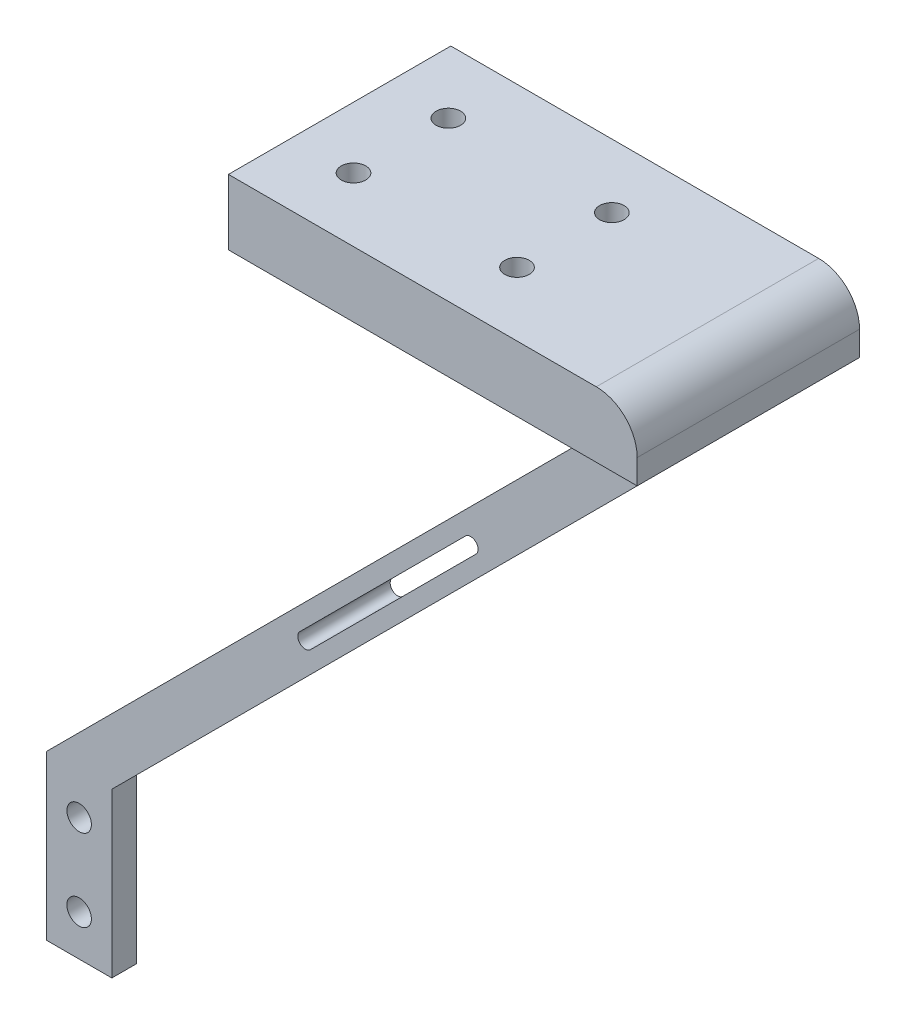
ISO-10303-21;
HEADER;
FILE_DESCRIPTION(('STEP AP214'),'2;1');
FILE_NAME('part.step','',(''),(''),'','','');
FILE_SCHEMA(('AUTOMOTIVE_DESIGN { 1 0 10303 214 1 1 1 1 }'));
ENDSEC;
DATA;
#1=APPLICATION_CONTEXT('core data for automotive mechanical design processes');
#2=APPLICATION_PROTOCOL_DEFINITION('international standard','automotive_design',2000,#1);
#3=PRODUCT_CONTEXT('',#1,'mechanical');
#4=PRODUCT('Part','Part','',(#3));
#5=PRODUCT_RELATED_PRODUCT_CATEGORY('part','',(#4));
#6=PRODUCT_DEFINITION_FORMATION('','',#4);
#7=PRODUCT_DEFINITION_CONTEXT('part definition',#1,'design');
#8=PRODUCT_DEFINITION('design','',#6,#7);
#9=PRODUCT_DEFINITION_SHAPE('','',#8);
#10=(LENGTH_UNIT() NAMED_UNIT(*) SI_UNIT(.MILLI.,.METRE.));
#11=(NAMED_UNIT(*) PLANE_ANGLE_UNIT() SI_UNIT($,.RADIAN.));
#12=(NAMED_UNIT(*) SI_UNIT($,.STERADIAN.) SOLID_ANGLE_UNIT());
#13=UNCERTAINTY_MEASURE_WITH_UNIT(LENGTH_MEASURE(1.E-05),#10,'distance_accuracy_value','');
#14=(GEOMETRIC_REPRESENTATION_CONTEXT(3) GLOBAL_UNCERTAINTY_ASSIGNED_CONTEXT((#13)) GLOBAL_UNIT_ASSIGNED_CONTEXT((#10,
#11,#12)) REPRESENTATION_CONTEXT('',''));
#15=CARTESIAN_POINT('',(0.,0.,0.));
#16=DIRECTION('',(0.,0.,1.));
#17=DIRECTION('',(1.,0.,0.));
#18=AXIS2_PLACEMENT_3D('',#15,#16,#17);
#19=CARTESIAN_POINT('',(0.,-901.769321881352,7.4499999999999));
#20=DIRECTION('',(0.,-1.,0.));
#21=DIRECTION('',(0.,0.,-1.));
#22=AXIS2_PLACEMENT_3D('',#19,#20,#21);
#23=PLANE('',#22);
#24=CARTESIAN_POINT('',(33.720070615742,-901.769321881352,1.64999999999989));
#25=DIRECTION('',(0.,-1.,0.));
#26=DIRECTION('',(0.,0.,-1.));
#27=AXIS2_PLACEMENT_3D('',#24,#25,#26);
#28=CIRCLE('',#27,1.5);
#29=CARTESIAN_POINT('',(33.720070615742,-901.769321881352,0.149999999999891));
#30=VERTEX_POINT('',#29);
#31=EDGE_CURVE('E228',#30,#30,#28,.T.);
#32=ORIENTED_EDGE('',*,*,#31,.F.);
#33=EDGE_LOOP('',(#32));
#34=FACE_BOUND('',#33,.T.);
#35=CARTESIAN_POINT('',(13.720070615742,-901.769321881352,1.64999999999989));
#36=DIRECTION('',(0.,-1.,0.));
#37=DIRECTION('',(0.,0.,-1.));
#38=AXIS2_PLACEMENT_3D('',#35,#36,#37);
#39=CIRCLE('',#38,1.5);
#40=CARTESIAN_POINT('',(13.720070615742,-901.769321881352,0.14999999999989));
#41=VERTEX_POINT('',#40);
#42=EDGE_CURVE('E240',#41,#41,#39,.T.);
#43=ORIENTED_EDGE('',*,*,#42,.F.);
#44=EDGE_LOOP('',(#43));
#45=FACE_BOUND('',#44,.T.);
#46=DIRECTION('',(0.,0.,-1.));
#47=VECTOR('',#46,1.);
#48=CARTESIAN_POINT('',(42.2200706157402,-901.769321881352,11.4852813742387));
#49=LINE('',#48,#47);
#50=CARTESIAN_POINT('',(42.2200706157402,-901.769321881352,3.));
#51=VERTEX_POINT('',#50);
#52=CARTESIAN_POINT('',(42.2200706157402,-901.769321881352,-8.3000000000001));
#53=VERTEX_POINT('',#52);
#54=EDGE_CURVE('E296',#51,#53,#49,.T.);
#55=ORIENTED_EDGE('',*,*,#54,.F.);
#56=DIRECTION('',(1.,0.,0.));
#57=VECTOR('',#56,1.);
#58=CARTESIAN_POINT('',(1.21129623552184E-11,-901.769321881353,3.));
#59=LINE('',#58,#57);
#60=CARTESIAN_POINT('',(56.2200706157419,-901.769321881352,3.));
#61=VERTEX_POINT('',#60);
#62=EDGE_CURVE('E368',#51,#61,#59,.T.);
#63=ORIENTED_EDGE('',*,*,#62,.T.);
#64=DIRECTION('',(0.,0.,-1.));
#65=VECTOR('',#64,1.);
#66=CARTESIAN_POINT('',(56.2200706157419,-901.769321881352,7.4499999999999));
#67=LINE('',#66,#65);
#68=CARTESIAN_POINT('',(56.220070615742,-901.769321881352,9.4499999999999));
#69=VERTEX_POINT('',#68);
#70=EDGE_CURVE('E332',#69,#61,#67,.T.);
#71=ORIENTED_EDGE('',*,*,#70,.F.);
#72=DIRECTION('',(1.,0.,0.));
#73=VECTOR('',#72,1.);
#74=CARTESIAN_POINT('',(2.25190750407005E-12,-901.769321881352,9.4499999999999));
#75=LINE('',#74,#73);
#76=CARTESIAN_POINT('',(6.22007061574198,-901.769321881352,9.4499999999999));
#77=VERTEX_POINT('',#76);
#78=EDGE_CURVE('E277',#77,#69,#75,.T.);
#79=ORIENTED_EDGE('',*,*,#78,.F.);
#80=DIRECTION('',(0.,0.,-1.));
#81=VECTOR('',#80,1.);
#82=CARTESIAN_POINT('',(6.22007061574196,-901.769321881352,7.4499999999999));
#83=LINE('',#82,#81);
#84=CARTESIAN_POINT('',(6.22007061574198,-901.769321881352,-17.7500000000001));
#85=VERTEX_POINT('',#84);
#86=EDGE_CURVE('E309',#77,#85,#83,.T.);
#87=ORIENTED_EDGE('',*,*,#86,.T.);
#88=DIRECTION('',(1.,0.,0.));
#89=VECTOR('',#88,1.);
#90=CARTESIAN_POINT('',(2.25190750407005E-12,-901.769321881352,-17.7500000000001));
#91=LINE('',#90,#89);
#92=CARTESIAN_POINT('',(56.220070615742,-901.769321881352,-17.7500000000001));
#93=VERTEX_POINT('',#92);
#94=EDGE_CURVE('E260',#85,#93,#91,.T.);
#95=ORIENTED_EDGE('',*,*,#94,.T.);
#96=CARTESIAN_POINT('',(56.2200706157419,-901.769321881352,-8.3000000000001));
#97=VERTEX_POINT('',#96);
#98=EDGE_CURVE('E331',#97,#93,#67,.T.);
#99=ORIENTED_EDGE('',*,*,#98,.F.);
#100=DIRECTION('',(1.,0.,0.));
#101=VECTOR('',#100,1.);
#102=CARTESIAN_POINT('',(1.21129623552184E-11,-901.769321881353,-8.3000000000001));
#103=LINE('',#102,#101);
#104=EDGE_CURVE('E336',#53,#97,#103,.T.);
#105=ORIENTED_EDGE('',*,*,#104,.F.);
#106=EDGE_LOOP('',(#55,#63,#71,#79,#87,#95,#99,#105));
#107=FACE_BOUND('',#106,.T.);
#108=CARTESIAN_POINT('',(33.720070615742,-901.769321881352,-9.95000000000009));
#109=DIRECTION('',(0.,-1.,0.));
#110=DIRECTION('',(0.,0.,-1.));
#111=AXIS2_PLACEMENT_3D('',#108,#109,#110);
#112=CIRCLE('',#111,1.5);
#113=CARTESIAN_POINT('',(33.720070615742,-901.769321881352,-11.4500000000001));
#114=VERTEX_POINT('',#113);
#115=EDGE_CURVE('E220',#114,#114,#112,.F.);
#116=ORIENTED_EDGE('',*,*,#115,.T.);
#117=EDGE_LOOP('',(#116));
#118=FACE_BOUND('',#117,.T.);
#119=CARTESIAN_POINT('',(13.720070615742,-901.769321881352,-9.95000000000009));
#120=DIRECTION('',(0.,-1.,0.));
#121=DIRECTION('',(0.,0.,-1.));
#122=AXIS2_PLACEMENT_3D('',#119,#120,#121);
#123=CIRCLE('',#122,1.5);
#124=CARTESIAN_POINT('',(13.720070615742,-901.769321881352,-11.4500000000001));
#125=VERTEX_POINT('',#124);
#126=EDGE_CURVE('E219',#125,#125,#123,.F.);
#127=ORIENTED_EDGE('',*,*,#126,.T.);
#128=EDGE_LOOP('',(#127));
#129=FACE_BOUND('',#128,.T.);
#130=ADVANCED_FACE('F41',(#34,#45,#107,#118,#129),#23,.T.);
#131=CARTESIAN_POINT('',(1.98456655971258E-12,-893.769321881352,7.4499999999999));
#132=DIRECTION('',(0.,1.,0.));
#133=DIRECTION('',(-1.,0.,0.));
#134=AXIS2_PLACEMENT_3D('',#131,#132,#133);
#135=PLANE('',#134);
#136=CARTESIAN_POINT('',(33.720070615742,-893.769321881352,1.64999999999989));
#137=DIRECTION('',(0.,1.,0.));
#138=DIRECTION('',(-1.,0.,0.));
#139=AXIS2_PLACEMENT_3D('',#136,#137,#138);
#140=CIRCLE('',#139,1.5);
#141=CARTESIAN_POINT('',(32.220070615742,-893.769321881352,1.64999999999989));
#142=VERTEX_POINT('',#141);
#143=EDGE_CURVE('E224',#142,#142,#140,.F.);
#144=ORIENTED_EDGE('',*,*,#143,.T.);
#145=EDGE_LOOP('',(#144));
#146=FACE_BOUND('',#145,.T.);
#147=CARTESIAN_POINT('',(13.720070615742,-893.769321881352,1.64999999999989));
#148=DIRECTION('',(0.,1.,0.));
#149=DIRECTION('',(-1.,0.,0.));
#150=AXIS2_PLACEMENT_3D('',#147,#148,#149);
#151=CIRCLE('',#150,1.5);
#152=CARTESIAN_POINT('',(12.220070615742,-893.769321881352,1.64999999999989));
#153=VERTEX_POINT('',#152);
#154=EDGE_CURVE('E227',#153,#153,#151,.F.);
#155=ORIENTED_EDGE('',*,*,#154,.T.);
#156=EDGE_LOOP('',(#155));
#157=FACE_BOUND('',#156,.T.);
#158=DIRECTION('',(1.,0.,0.));
#159=VECTOR('',#158,1.);
#160=CARTESIAN_POINT('',(2.23414393567604E-12,-893.769321881352,9.4499999999999));
#161=LINE('',#160,#159);
#162=CARTESIAN_POINT('',(6.22007061574196,-893.769321881352,9.4499999999999));
#163=VERTEX_POINT('',#162);
#164=CARTESIAN_POINT('',(51.220070615742,-893.769321881352,9.4499999999999));
#165=VERTEX_POINT('',#164);
#166=EDGE_CURVE('E259',#163,#165,#161,.T.);
#167=ORIENTED_EDGE('',*,*,#166,.T.);
#168=DIRECTION('',(0.,0.,-1.));
#169=VECTOR('',#168,1.);
#170=CARTESIAN_POINT('',(51.220070615742,-893.769321881352,7.4499999999999));
#171=LINE('',#170,#169);
#172=CARTESIAN_POINT('',(51.220070615742,-893.769321881352,-17.7500000000001));
#173=VERTEX_POINT('',#172);
#174=EDGE_CURVE('E404',#165,#173,#171,.T.);
#175=ORIENTED_EDGE('',*,*,#174,.T.);
#176=DIRECTION('',(1.,0.,0.));
#177=VECTOR('',#176,1.);
#178=CARTESIAN_POINT('',(2.23414393567604E-12,-893.769321881352,-17.7500000000001));
#179=LINE('',#178,#177);
#180=CARTESIAN_POINT('',(6.22007061574196,-893.769321881352,-17.7500000000001));
#181=VERTEX_POINT('',#180);
#182=EDGE_CURVE('E264',#181,#173,#179,.T.);
#183=ORIENTED_EDGE('',*,*,#182,.F.);
#184=DIRECTION('',(0.,0.,-1.));
#185=VECTOR('',#184,1.);
#186=CARTESIAN_POINT('',(6.22007061574196,-893.769321881352,7.4499999999999));
#187=LINE('',#186,#185);
#188=EDGE_CURVE('E329',#163,#181,#187,.T.);
#189=ORIENTED_EDGE('',*,*,#188,.F.);
#190=EDGE_LOOP('',(#167,#175,#183,#189));
#191=FACE_BOUND('',#190,.T.);
#192=CARTESIAN_POINT('',(33.720070615742,-893.769321881352,-9.95000000000009));
#193=DIRECTION('',(0.,1.,0.));
#194=DIRECTION('',(-1.,0.,0.));
#195=AXIS2_PLACEMENT_3D('',#192,#193,#194);
#196=CIRCLE('',#195,1.5);
#197=CARTESIAN_POINT('',(32.220070615742,-893.769321881352,-9.95000000000009));
#198=VERTEX_POINT('',#197);
#199=EDGE_CURVE('E223',#198,#198,#196,.T.);
#200=ORIENTED_EDGE('',*,*,#199,.F.);
#201=EDGE_LOOP('',(#200));
#202=FACE_BOUND('',#201,.T.);
#203=CARTESIAN_POINT('',(13.720070615742,-893.769321881352,-9.95000000000009));
#204=DIRECTION('',(0.,1.,0.));
#205=DIRECTION('',(-1.,0.,0.));
#206=AXIS2_PLACEMENT_3D('',#203,#204,#205);
#207=CIRCLE('',#206,1.5);
#208=CARTESIAN_POINT('',(12.220070615742,-893.769321881352,-9.95000000000009));
#209=VERTEX_POINT('',#208);
#210=EDGE_CURVE('E231',#209,#209,#207,.T.);
#211=ORIENTED_EDGE('',*,*,#210,.F.);
#212=EDGE_LOOP('',(#211));
#213=FACE_BOUND('',#212,.T.);
#214=ADVANCED_FACE('F431',(#146,#157,#191,#202,#213),#135,.T.);
#215=CARTESIAN_POINT('',(0.,-896.019321881352,7.4499999999999));
#216=DIRECTION('',(0.,1.,0.));
#217=DIRECTION('',(0.,0.,1.));
#218=AXIS2_PLACEMENT_3D('',#215,#216,#217);
#219=PLANE('',#218);
#220=CARTESIAN_POINT('',(33.720070615742,-896.019321881352,-9.95000000000009));
#221=DIRECTION('',(0.,1.,0.));
#222=DIRECTION('',(0.,0.,1.));
#223=AXIS2_PLACEMENT_3D('',#220,#221,#222);
#224=CIRCLE('',#223,1.5);
#225=CARTESIAN_POINT('',(33.720070615742,-896.019321881352,-8.45000000000009));
#226=VERTEX_POINT('',#225);
#227=EDGE_CURVE('E248',#226,#226,#224,.T.);
#228=ORIENTED_EDGE('',*,*,#227,.T.);
#229=EDGE_LOOP('',(#228));
#230=FACE_BOUND('',#229,.T.);
#231=CARTESIAN_POINT('',(13.720070615742,-896.019321881352,1.64999999999989));
#232=DIRECTION('',(0.,1.,0.));
#233=DIRECTION('',(0.,0.,1.));
#234=AXIS2_PLACEMENT_3D('',#231,#232,#233);
#235=CIRCLE('',#234,1.5);
#236=CARTESIAN_POINT('',(13.720070615742,-896.019321881352,3.1499999999999));
#237=VERTEX_POINT('',#236);
#238=EDGE_CURVE('E244',#237,#237,#235,.F.);
#239=ORIENTED_EDGE('',*,*,#238,.F.);
#240=EDGE_LOOP('',(#239));
#241=FACE_BOUND('',#240,.T.);
#242=DIRECTION('',(1.,0.,0.));
#243=VECTOR('',#242,1.);
#244=CARTESIAN_POINT('',(0.,-896.019321881352,-15.7500000000001));
#245=LINE('',#244,#243);
#246=CARTESIAN_POINT('',(6.22007061574197,-896.019321881352,-15.7500000000001));
#247=VERTEX_POINT('',#246);
#248=CARTESIAN_POINT('',(40.220070615742,-896.019321881352,-15.7500000000001));
#249=VERTEX_POINT('',#248);
#250=EDGE_CURVE('E295',#247,#249,#245,.T.);
#251=ORIENTED_EDGE('',*,*,#250,.T.);
#252=DIRECTION('',(0.,0.,-1.));
#253=VECTOR('',#252,1.);
#254=CARTESIAN_POINT('',(40.220070615742,-896.019321881352,7.4499999999999));
#255=LINE('',#254,#253);
#256=CARTESIAN_POINT('',(40.220070615742,-896.019321881352,7.4499999999999));
#257=VERTEX_POINT('',#256);
#258=EDGE_CURVE('E323',#257,#249,#255,.T.);
#259=ORIENTED_EDGE('',*,*,#258,.F.);
#260=DIRECTION('',(1.,0.,0.));
#261=VECTOR('',#260,1.);
#262=CARTESIAN_POINT('',(0.,-896.019321881352,7.4499999999999));
#263=LINE('',#262,#261);
#264=CARTESIAN_POINT('',(6.22007061574197,-896.019321881352,7.4499999999999));
#265=VERTEX_POINT('',#264);
#266=EDGE_CURVE('E301',#265,#257,#263,.T.);
#267=ORIENTED_EDGE('',*,*,#266,.F.);
#268=DIRECTION('',(0.,0.,-1.));
#269=VECTOR('',#268,1.);
#270=CARTESIAN_POINT('',(6.22007061574196,-896.019321881352,7.4499999999999));
#271=LINE('',#270,#269);
#272=EDGE_CURVE('E326',#265,#247,#271,.T.);
#273=ORIENTED_EDGE('',*,*,#272,.T.);
#274=EDGE_LOOP('',(#251,#259,#267,#273));
#275=FACE_BOUND('',#274,.T.);
#276=CARTESIAN_POINT('',(33.720070615742,-896.019321881352,1.64999999999989));
#277=DIRECTION('',(0.,1.,0.));
#278=DIRECTION('',(0.,0.,1.));
#279=AXIS2_PLACEMENT_3D('',#276,#277,#278);
#280=CIRCLE('',#279,1.5);
#281=CARTESIAN_POINT('',(33.720070615742,-896.019321881352,3.1499999999999));
#282=VERTEX_POINT('',#281);
#283=EDGE_CURVE('E252',#282,#282,#280,.F.);
#284=ORIENTED_EDGE('',*,*,#283,.F.);
#285=EDGE_LOOP('',(#284));
#286=FACE_BOUND('',#285,.T.);
#287=CARTESIAN_POINT('',(13.720070615742,-896.019321881352,-9.95000000000009));
#288=DIRECTION('',(0.,1.,0.));
#289=DIRECTION('',(0.,0.,1.));
#290=AXIS2_PLACEMENT_3D('',#287,#288,#289);
#291=CIRCLE('',#290,1.5);
#292=CARTESIAN_POINT('',(13.720070615742,-896.019321881352,-8.45000000000009));
#293=VERTEX_POINT('',#292);
#294=EDGE_CURVE('E256',#293,#293,#291,.T.);
#295=ORIENTED_EDGE('',*,*,#294,.T.);
#296=EDGE_LOOP('',(#295));
#297=FACE_BOUND('',#296,.T.);
#298=ADVANCED_FACE('F498',(#230,#241,#275,#286,#297),#219,.F.);
#299=CARTESIAN_POINT('',(0.,-899.519321881352,7.4499999999999));
#300=DIRECTION('',(0.,1.,0.));
#301=DIRECTION('',(0.,0.,1.));
#302=AXIS2_PLACEMENT_3D('',#299,#300,#301);
#303=PLANE('',#302);
#304=CARTESIAN_POINT('',(33.720070615742,-899.519321881352,1.64999999999989));
#305=DIRECTION('',(0.,1.,0.));
#306=DIRECTION('',(0.,0.,1.));
#307=AXIS2_PLACEMENT_3D('',#304,#305,#306);
#308=CIRCLE('',#307,1.5);
#309=CARTESIAN_POINT('',(33.720070615742,-899.519321881352,3.1499999999999));
#310=VERTEX_POINT('',#309);
#311=EDGE_CURVE('E251',#310,#310,#308,.F.);
#312=ORIENTED_EDGE('',*,*,#311,.T.);
#313=EDGE_LOOP('',(#312));
#314=FACE_BOUND('',#313,.T.);
#315=CARTESIAN_POINT('',(13.720070615742,-899.519321881352,1.64999999999989));
#316=DIRECTION('',(0.,1.,0.));
#317=DIRECTION('',(0.,0.,1.));
#318=AXIS2_PLACEMENT_3D('',#315,#316,#317);
#319=CIRCLE('',#318,1.5);
#320=CARTESIAN_POINT('',(13.720070615742,-899.519321881352,3.1499999999999));
#321=VERTEX_POINT('',#320);
#322=EDGE_CURVE('E243',#321,#321,#319,.F.);
#323=ORIENTED_EDGE('',*,*,#322,.T.);
#324=EDGE_LOOP('',(#323));
#325=FACE_BOUND('',#324,.T.);
#326=DIRECTION('',(1.,0.,0.));
#327=VECTOR('',#326,1.);
#328=CARTESIAN_POINT('',(0.,-899.519321881352,-15.7500000000001));
#329=LINE('',#328,#327);
#330=CARTESIAN_POINT('',(6.22007061574197,-899.519321881352,-15.7500000000001));
#331=VERTEX_POINT('',#330);
#332=CARTESIAN_POINT('',(40.220070615742,-899.519321881352,-15.7500000000001));
#333=VERTEX_POINT('',#332);
#334=EDGE_CURVE('E304',#331,#333,#329,.T.);
#335=ORIENTED_EDGE('',*,*,#334,.F.);
#336=DIRECTION('',(0.,0.,-1.));
#337=VECTOR('',#336,1.);
#338=CARTESIAN_POINT('',(6.22007061574196,-899.519321881352,7.4499999999999));
#339=LINE('',#338,#337);
#340=CARTESIAN_POINT('',(6.22007061574197,-899.519321881352,7.4499999999999));
#341=VERTEX_POINT('',#340);
#342=EDGE_CURVE('E317',#341,#331,#339,.T.);
#343=ORIENTED_EDGE('',*,*,#342,.F.);
#344=DIRECTION('',(1.,0.,0.));
#345=VECTOR('',#344,1.);
#346=CARTESIAN_POINT('',(0.,-899.519321881352,7.4499999999999));
#347=LINE('',#346,#345);
#348=CARTESIAN_POINT('',(40.220070615742,-899.519321881352,7.4499999999999));
#349=VERTEX_POINT('',#348);
#350=EDGE_CURVE('E306',#341,#349,#347,.T.);
#351=ORIENTED_EDGE('',*,*,#350,.T.);
#352=DIRECTION('',(0.,0.,-1.));
#353=VECTOR('',#352,1.);
#354=CARTESIAN_POINT('',(40.220070615742,-899.519321881352,7.4499999999999));
#355=LINE('',#354,#353);
#356=EDGE_CURVE('E320',#349,#333,#355,.T.);
#357=ORIENTED_EDGE('',*,*,#356,.T.);
#358=EDGE_LOOP('',(#335,#343,#351,#357));
#359=FACE_BOUND('',#358,.T.);
#360=CARTESIAN_POINT('',(33.720070615742,-899.519321881352,-9.95000000000009));
#361=DIRECTION('',(0.,1.,0.));
#362=DIRECTION('',(0.,0.,1.));
#363=AXIS2_PLACEMENT_3D('',#360,#361,#362);
#364=CIRCLE('',#363,1.5);
#365=CARTESIAN_POINT('',(33.720070615742,-899.519321881352,-8.45000000000009));
#366=VERTEX_POINT('',#365);
#367=EDGE_CURVE('E247',#366,#366,#364,.T.);
#368=ORIENTED_EDGE('',*,*,#367,.F.);
#369=EDGE_LOOP('',(#368));
#370=FACE_BOUND('',#369,.T.);
#371=CARTESIAN_POINT('',(13.720070615742,-899.519321881352,-9.95000000000009));
#372=DIRECTION('',(0.,1.,0.));
#373=DIRECTION('',(0.,0.,1.));
#374=AXIS2_PLACEMENT_3D('',#371,#372,#373);
#375=CIRCLE('',#374,1.5);
#376=CARTESIAN_POINT('',(13.720070615742,-899.519321881352,-8.45000000000009));
#377=VERTEX_POINT('',#376);
#378=EDGE_CURVE('E255',#377,#377,#375,.T.);
#379=ORIENTED_EDGE('',*,*,#378,.F.);
#380=EDGE_LOOP('',(#379));
#381=FACE_BOUND('',#380,.T.);
#382=ADVANCED_FACE('F485',(#314,#325,#359,#370,#381),#303,.T.);
#383=CARTESIAN_POINT('',(474.994696248546,-474.994696248551,3.));
#384=DIRECTION('',(-0.707106781186544,0.707106781186551,0.));
#385=DIRECTION('',(-0.707106781186551,-0.707106781186544,0.));
#386=AXIS2_PLACEMENT_3D('',#383,#384,#385);
#387=PLANE('',#386);
#388=DIRECTION('',(0.707106781186551,0.707106781186544,0.));
#389=VECTOR('',#388,1.);
#390=CARTESIAN_POINT('',(474.994696248546,-474.994696248551,3.));
#391=LINE('',#390,#389);
#392=CARTESIAN_POINT('',(-22.4906075029149,-972.480000000007,3.));
#393=VERTEX_POINT('',#392);
#394=CARTESIAN_POINT('',(42.2200706157402,-907.769321881352,3.));
#395=VERTEX_POINT('',#394);
#396=EDGE_CURVE('E371',#393,#395,#391,.T.);
#397=ORIENTED_EDGE('',*,*,#396,.T.);
#398=DIRECTION('',(0.,0.,-1.));
#399=VECTOR('',#398,1.);
#400=CARTESIAN_POINT('',(42.2200706157402,-907.769321881352,11.4852813742387));
#401=LINE('',#400,#399);
#402=CARTESIAN_POINT('',(42.2200706157402,-907.769321881352,-8.3000000000001));
#403=VERTEX_POINT('',#402);
#404=EDGE_CURVE('E291',#395,#403,#401,.T.);
#405=ORIENTED_EDGE('',*,*,#404,.T.);
#406=DIRECTION('',(0.707106781186551,0.707106781186544,0.));
#407=VECTOR('',#406,1.);
#408=CARTESIAN_POINT('',(474.994696248546,-474.994696248551,-8.3000000000001));
#409=LINE('',#408,#407);
#410=CARTESIAN_POINT('',(-22.4906075029149,-972.480000000007,-8.3000000000001));
#411=VERTEX_POINT('',#410);
#412=EDGE_CURVE('E338',#411,#403,#409,.T.);
#413=ORIENTED_EDGE('',*,*,#412,.F.);
#414=DIRECTION('',(0.,0.,1.));
#415=VECTOR('',#414,1.);
#416=CARTESIAN_POINT('',(-22.4906075029149,-972.480000000007,-8.3000000000001));
#417=LINE('',#416,#415);
#418=CARTESIAN_POINT('',(-22.4906075029149,-972.480000000007,0.));
#419=VERTEX_POINT('',#418);
#420=EDGE_CURVE('E346',#411,#419,#417,.T.);
#421=ORIENTED_EDGE('',*,*,#420,.T.);
#422=DIRECTION('',(0.,0.,-1.));
#423=VECTOR('',#422,1.);
#424=CARTESIAN_POINT('',(-22.4906075029149,-972.480000000007,3.));
#425=LINE('',#424,#423);
#426=EDGE_CURVE('E395',#393,#419,#425,.T.);
#427=ORIENTED_EDGE('',*,*,#426,.F.);
#428=EDGE_LOOP('',(#397,#405,#413,#421,#427));
#429=FACE_BOUND('',#428,.T.);
#430=ADVANCED_FACE('F466',(#429),#387,.T.);
#431=CARTESIAN_POINT('',(0.,0.,0.));
#432=DIRECTION('',(0.,0.,1.));
#433=DIRECTION('',(1.,0.,0.));
#434=AXIS2_PLACEMENT_3D('',#431,#432,#433);
#435=PLANE('',#434);
#436=CARTESIAN_POINT('',(-18.4906075028776,-977.480000000007,0.));
#437=DIRECTION('',(0.,0.,1.));
#438=DIRECTION('',(1.,0.,0.));
#439=AXIS2_PLACEMENT_3D('',#436,#437,#438);
#440=CIRCLE('',#439,1.50000000001363);
#441=CARTESIAN_POINT('',(-16.9906075028639,-977.480000000007,0.));
#442=VERTEX_POINT('',#441);
#443=EDGE_CURVE('E381',#442,#442,#440,.T.);
#444=ORIENTED_EDGE('',*,*,#443,.T.);
#445=EDGE_LOOP('',(#444));
#446=FACE_BOUND('',#445,.T.);
#447=CARTESIAN_POINT('',(-18.4906075028776,-987.480000000007,0.));
#448=DIRECTION('',(0.,0.,1.));
#449=DIRECTION('',(1.,0.,0.));
#450=AXIS2_PLACEMENT_3D('',#447,#448,#449);
#451=CIRCLE('',#450,1.50000000001363);
#452=CARTESIAN_POINT('',(-16.9906075028639,-987.480000000007,0.));
#453=VERTEX_POINT('',#452);
#454=EDGE_CURVE('E352',#453,#453,#451,.T.);
#455=ORIENTED_EDGE('',*,*,#454,.T.);
#456=EDGE_LOOP('',(#455));
#457=FACE_BOUND('',#456,.T.);
#458=DIRECTION('',(-1.,0.,0.));
#459=VECTOR('',#458,1.);
#460=CARTESIAN_POINT('',(0.,-972.480000000007,0.));
#461=LINE('',#460,#459);
#462=CARTESIAN_POINT('',(-14.4906075029133,-972.480000000007,0.));
#463=VERTEX_POINT('',#462);
#464=EDGE_CURVE('E335',#463,#419,#461,.T.);
#465=ORIENTED_EDGE('',*,*,#464,.F.);
#466=DIRECTION('',(-1.7916632230118E-12,1.,0.));
#467=VECTOR('',#466,1.);
#468=CARTESIAN_POINT('',(-14.4906075046556,-2.59622885451903E-11,0.));
#469=LINE('',#468,#467);
#470=CARTESIAN_POINT('',(-14.4906075027914,-992.480000000007,0.));
#471=VERTEX_POINT('',#470);
#472=EDGE_CURVE('E384',#471,#463,#469,.T.);
#473=ORIENTED_EDGE('',*,*,#472,.F.);
#474=DIRECTION('',(1.,0.,0.));
#475=VECTOR('',#474,1.);
#476=CARTESIAN_POINT('',(0.,-992.480000000007,0.));
#477=LINE('',#476,#475);
#478=CARTESIAN_POINT('',(-22.4906075029149,-992.480000000007,0.));
#479=VERTEX_POINT('',#478);
#480=EDGE_CURVE('E359',#479,#471,#477,.T.);
#481=ORIENTED_EDGE('',*,*,#480,.F.);
#482=DIRECTION('',(0.,-1.,0.));
#483=VECTOR('',#482,1.);
#484=CARTESIAN_POINT('',(-22.4906075029149,0.,0.));
#485=LINE('',#484,#483);
#486=EDGE_CURVE('E387',#419,#479,#485,.T.);
#487=ORIENTED_EDGE('',*,*,#486,.F.);
#488=EDGE_LOOP('',(#465,#473,#481,#487));
#489=FACE_BOUND('',#488,.T.);
#490=ADVANCED_FACE('F475',(#446,#457,#489),#435,.F.);
#491=CARTESIAN_POINT('',(-14.4906075046556,-2.59622885451903E-11,3.));
#492=DIRECTION('',(-1.,-1.7916632230118E-12,0.));
#493=DIRECTION('',(1.7916632230118E-12,-1.,0.));
#494=AXIS2_PLACEMENT_3D('',#491,#492,#493);
#495=PLANE('',#494);
#496=ORIENTED_EDGE('',*,*,#472,.T.);
#497=DIRECTION('',(0.,0.,-1.));
#498=VECTOR('',#497,1.);
#499=CARTESIAN_POINT('',(-14.4906075029133,-972.480000000007,3.));
#500=LINE('',#499,#498);
#501=CARTESIAN_POINT('',(-14.4906075029133,-972.480000000007,3.));
#502=VERTEX_POINT('',#501);
#503=EDGE_CURVE('E401',#502,#463,#500,.T.);
#504=ORIENTED_EDGE('',*,*,#503,.F.);
#505=DIRECTION('',(-1.7916632230118E-12,1.,0.));
#506=VECTOR('',#505,1.);
#507=CARTESIAN_POINT('',(-14.4906075046556,-2.59622885451903E-11,3.));
#508=LINE('',#507,#506);
#509=CARTESIAN_POINT('',(-14.4906075027914,-992.480000000007,3.));
#510=VERTEX_POINT('',#509);
#511=EDGE_CURVE('E362',#510,#502,#508,.T.);
#512=ORIENTED_EDGE('',*,*,#511,.F.);
#513=DIRECTION('',(0.,0.,-1.));
#514=VECTOR('',#513,1.);
#515=CARTESIAN_POINT('',(-14.4906075027914,-992.480000000007,3.));
#516=LINE('',#515,#514);
#517=EDGE_CURVE('E378',#510,#471,#516,.T.);
#518=ORIENTED_EDGE('',*,*,#517,.T.);
#519=EDGE_LOOP('',(#496,#504,#512,#518));
#520=FACE_BOUND('',#519,.T.);
#521=ADVANCED_FACE('F455',(#520),#495,.F.);
#522=CARTESIAN_POINT('',(478.994696248547,-478.994696248552,3.));
#523=DIRECTION('',(-0.707106781186544,0.707106781186551,0.));
#524=DIRECTION('',(-0.707106781186551,-0.707106781186544,0.));
#525=AXIS2_PLACEMENT_3D('',#522,#523,#524);
#526=PLANE('',#525);
#527=ORIENTED_EDGE('',*,*,#503,.T.);
#528=DIRECTION('',(0.,0.,1.));
#529=VECTOR('',#528,1.);
#530=CARTESIAN_POINT('',(-14.4906075029133,-972.480000000007,-8.3000000000001));
#531=LINE('',#530,#529);
#532=CARTESIAN_POINT('',(-14.4906075029133,-972.480000000007,-8.3000000000001));
#533=VERTEX_POINT('',#532);
#534=EDGE_CURVE('E349',#533,#463,#531,.T.);
#535=ORIENTED_EDGE('',*,*,#534,.F.);
#536=DIRECTION('',(0.707106781186551,0.707106781186544,0.));
#537=VECTOR('',#536,1.);
#538=CARTESIAN_POINT('',(478.994696248547,-478.994696248552,-8.3000000000001));
#539=LINE('',#538,#537);
#540=EDGE_CURVE('E343',#533,#97,#539,.T.);
#541=ORIENTED_EDGE('',*,*,#540,.T.);
#542=DIRECTION('',(0.,0.,-1.));
#543=VECTOR('',#542,1.);
#544=CARTESIAN_POINT('',(56.2200706157419,-901.769321881352,3.));
#545=LINE('',#544,#543);
#546=EDGE_CURVE('E398',#61,#97,#545,.T.);
#547=ORIENTED_EDGE('',*,*,#546,.F.);
#548=DIRECTION('',(0.707106781186551,0.707106781186544,0.));
#549=VECTOR('',#548,1.);
#550=CARTESIAN_POINT('',(478.994696248547,-478.994696248552,3.));
#551=LINE('',#550,#549);
#552=EDGE_CURVE('E365',#502,#61,#551,.T.);
#553=ORIENTED_EDGE('',*,*,#552,.F.);
#554=EDGE_LOOP('',(#527,#535,#541,#547,#553));
#555=FACE_BOUND('',#554,.T.);
#556=ADVANCED_FACE('F445',(#555),#526,.F.);
#557=CARTESIAN_POINT('',(-22.4906075029149,0.,3.));
#558=DIRECTION('',(1.,0.,0.));
#559=DIRECTION('',(0.,0.,-1.));
#560=AXIS2_PLACEMENT_3D('',#557,#558,#559);
#561=PLANE('',#560);
#562=ORIENTED_EDGE('',*,*,#486,.T.);
#563=DIRECTION('',(0.,0.,-1.));
#564=VECTOR('',#563,1.);
#565=CARTESIAN_POINT('',(-22.4906075029149,-992.480000000007,3.));
#566=LINE('',#565,#564);
#567=CARTESIAN_POINT('',(-22.4906075029149,-992.480000000007,3.));
#568=VERTEX_POINT('',#567);
#569=EDGE_CURVE('E392',#568,#479,#566,.T.);
#570=ORIENTED_EDGE('',*,*,#569,.F.);
#571=DIRECTION('',(0.,-1.,0.));
#572=VECTOR('',#571,1.);
#573=CARTESIAN_POINT('',(-22.4906075029149,0.,3.));
#574=LINE('',#573,#572);
#575=EDGE_CURVE('E374',#393,#568,#574,.T.);
#576=ORIENTED_EDGE('',*,*,#575,.F.);
#577=ORIENTED_EDGE('',*,*,#426,.T.);
#578=EDGE_LOOP('',(#562,#570,#576,#577));
#579=FACE_BOUND('',#578,.T.);
#580=ADVANCED_FACE('F470',(#579),#561,.F.);
#581=CARTESIAN_POINT('',(-18.4906075028776,-977.480000000007,3.));
#582=DIRECTION('',(0.,0.,-1.));
#583=DIRECTION('',(-1.,0.,0.));
#584=AXIS2_PLACEMENT_3D('',#581,#582,#583);
#585=CYLINDRICAL_SURFACE('',#584,1.50000000001363);
#586=CARTESIAN_POINT('',(-18.4906075028776,-977.480000000007,3.));
#587=DIRECTION('',(0.,0.,1.));
#588=DIRECTION('',(1.,0.,0.));
#589=AXIS2_PLACEMENT_3D('',#586,#587,#588);
#590=CIRCLE('',#589,1.50000000001363);
#591=CARTESIAN_POINT('',(-16.9906075028639,-977.480000000007,3.));
#592=VERTEX_POINT('',#591);
#593=EDGE_CURVE('E358',#592,#592,#590,.T.);
#594=ORIENTED_EDGE('',*,*,#593,.T.);
#595=EDGE_LOOP('',(#594));
#596=FACE_BOUND('',#595,.T.);
#597=ORIENTED_EDGE('',*,*,#443,.F.);
#598=EDGE_LOOP('',(#597));
#599=FACE_BOUND('',#598,.T.);
#600=ADVANCED_FACE('F520',(#596,#599),#585,.F.);
#601=CARTESIAN_POINT('',(-18.4906075028776,-987.480000000007,3.));
#602=DIRECTION('',(0.,0.,-1.));
#603=DIRECTION('',(-1.,0.,0.));
#604=AXIS2_PLACEMENT_3D('',#601,#602,#603);
#605=CYLINDRICAL_SURFACE('',#604,1.50000000001363);
#606=CARTESIAN_POINT('',(-18.4906075028776,-987.480000000007,3.));
#607=DIRECTION('',(0.,0.,1.));
#608=DIRECTION('',(1.,0.,0.));
#609=AXIS2_PLACEMENT_3D('',#606,#607,#608);
#610=CIRCLE('',#609,1.50000000001363);
#611=CARTESIAN_POINT('',(-16.9906075028639,-987.480000000007,3.));
#612=VERTEX_POINT('',#611);
#613=EDGE_CURVE('E355',#612,#612,#610,.T.);
#614=ORIENTED_EDGE('',*,*,#613,.T.);
#615=EDGE_LOOP('',(#614));
#616=FACE_BOUND('',#615,.T.);
#617=ORIENTED_EDGE('',*,*,#454,.F.);
#618=EDGE_LOOP('',(#617));
#619=FACE_BOUND('',#618,.T.);
#620=ADVANCED_FACE('F513',(#616,#619),#605,.F.);
#621=CARTESIAN_POINT('',(0.,-992.480000000007,3.));
#622=DIRECTION('',(0.,1.,0.));
#623=DIRECTION('',(0.,0.,1.));
#624=AXIS2_PLACEMENT_3D('',#621,#622,#623);
#625=PLANE('',#624);
#626=ORIENTED_EDGE('',*,*,#480,.T.);
#627=ORIENTED_EDGE('',*,*,#517,.F.);
#628=DIRECTION('',(1.,0.,0.));
#629=VECTOR('',#628,1.);
#630=CARTESIAN_POINT('',(0.,-992.480000000007,3.));
#631=LINE('',#630,#629);
#632=EDGE_CURVE('E376',#568,#510,#631,.T.);
#633=ORIENTED_EDGE('',*,*,#632,.F.);
#634=ORIENTED_EDGE('',*,*,#569,.T.);
#635=EDGE_LOOP('',(#626,#627,#633,#634));
#636=FACE_BOUND('',#635,.T.);
#637=ADVANCED_FACE('F473',(#636),#625,.F.);
#638=CARTESIAN_POINT('',(0.,0.,3.));
#639=DIRECTION('',(0.,0.,1.));
#640=DIRECTION('',(1.,0.,0.));
#641=AXIS2_PLACEMENT_3D('',#638,#639,#640);
#642=PLANE('',#641);
#643=CARTESIAN_POINT('',(29.4019113831897,-924.673595371056,3.));
#644=DIRECTION('',(0.,0.,1.));
#645=DIRECTION('',(1.,0.,0.));
#646=AXIS2_PLACEMENT_3D('',#643,#644,#645);
#647=CIRCLE('',#646,0.905774434605758);
#648=CARTESIAN_POINT('',(30.0423906281249,-925.314074615992,3.));
#649=VERTEX_POINT('',#648);
#650=CARTESIAN_POINT('',(28.7614321382545,-924.033116126121,3.));
#651=VERTEX_POINT('',#650);
#652=EDGE_CURVE('E217',#649,#651,#647,.T.);
#653=ORIENTED_EDGE('',*,*,#652,.F.);
#654=DIRECTION('',(0.707106781186554,0.707106781186541,0.));
#655=VECTOR('',#654,1.);
#656=CARTESIAN_POINT('',(477.678232622058,-477.678232622067,3.));
#657=LINE('',#656,#655);
#658=CARTESIAN_POINT('',(9.80324648817116,-945.553218755945,3.));
#659=VERTEX_POINT('',#658);
#660=EDGE_CURVE('E209',#659,#649,#657,.T.);
#661=ORIENTED_EDGE('',*,*,#660,.F.);
#662=CARTESIAN_POINT('',(9.16276724323615,-944.91273951101,3.));
#663=DIRECTION('',(0.,0.,1.));
#664=DIRECTION('',(1.,0.,0.));
#665=AXIS2_PLACEMENT_3D('',#662,#663,#664);
#666=CIRCLE('',#665,0.905774434605758);
#667=CARTESIAN_POINT('',(8.52228799830079,-944.272260266074,3.));
#668=VERTEX_POINT('',#667);
#669=EDGE_CURVE('E189',#668,#659,#666,.T.);
#670=ORIENTED_EDGE('',*,*,#669,.F.);
#671=DIRECTION('',(0.707106781186554,0.707106781186541,0.));
#672=VECTOR('',#671,1.);
#673=CARTESIAN_POINT('',(476.397274132188,-476.397274132196,3.));
#674=LINE('',#673,#672);
#675=EDGE_CURVE('E214',#668,#651,#674,.T.);
#676=ORIENTED_EDGE('',*,*,#675,.T.);
#677=EDGE_LOOP('',(#653,#661,#670,#676));
#678=FACE_BOUND('',#677,.T.);
#679=ORIENTED_EDGE('',*,*,#613,.F.);
#680=EDGE_LOOP('',(#679));
#681=FACE_BOUND('',#680,.T.);
#682=ORIENTED_EDGE('',*,*,#593,.F.);
#683=EDGE_LOOP('',(#682));
#684=FACE_BOUND('',#683,.T.);
#685=ORIENTED_EDGE('',*,*,#511,.T.);
#686=ORIENTED_EDGE('',*,*,#552,.T.);
#687=ORIENTED_EDGE('',*,*,#62,.F.);
#688=DIRECTION('',(0.,-1.,0.));
#689=VECTOR('',#688,1.);
#690=CARTESIAN_POINT('',(42.2200706157402,0.,3.));
#691=LINE('',#690,#689);
#692=EDGE_CURVE('E292',#51,#395,#691,.T.);
#693=ORIENTED_EDGE('',*,*,#692,.T.);
#694=ORIENTED_EDGE('',*,*,#396,.F.);
#695=ORIENTED_EDGE('',*,*,#575,.T.);
#696=ORIENTED_EDGE('',*,*,#632,.T.);
#697=EDGE_LOOP('',(#685,#686,#687,#693,#694,#695,#696));
#698=FACE_BOUND('',#697,.T.);
#699=ADVANCED_FACE('F448',(#678,#681,#684,#698),#642,.T.);
#700=CARTESIAN_POINT('',(0.,-972.480000000007,-8.3000000000001));
#701=DIRECTION('',(0.,1.,0.));
#702=DIRECTION('',(0.,0.,1.));
#703=AXIS2_PLACEMENT_3D('',#700,#701,#702);
#704=PLANE('',#703);
#705=ORIENTED_EDGE('',*,*,#464,.T.);
#706=ORIENTED_EDGE('',*,*,#420,.F.);
#707=DIRECTION('',(-1.,0.,0.));
#708=VECTOR('',#707,1.);
#709=CARTESIAN_POINT('',(0.,-972.480000000007,-8.3000000000001));
#710=LINE('',#709,#708);
#711=EDGE_CURVE('E341',#533,#411,#710,.T.);
#712=ORIENTED_EDGE('',*,*,#711,.F.);
#713=ORIENTED_EDGE('',*,*,#534,.T.);
#714=EDGE_LOOP('',(#705,#706,#712,#713));
#715=FACE_BOUND('',#714,.T.);
#716=ADVANCED_FACE('F460',(#715),#704,.F.);
#717=CARTESIAN_POINT('',(0.,0.,-8.3000000000001));
#718=DIRECTION('',(0.,0.,1.));
#719=DIRECTION('',(1.,0.,0.));
#720=AXIS2_PLACEMENT_3D('',#717,#718,#719);
#721=PLANE('',#720);
#722=DIRECTION('',(-0.707106781186554,-0.707106781186541,0.));
#723=VECTOR('',#722,1.);
#724=CARTESIAN_POINT('',(477.678232622058,-477.678232622067,-8.3000000000001));
#725=LINE('',#724,#723);
#726=CARTESIAN_POINT('',(30.0423906281249,-925.314074615992,-8.3000000000001));
#727=VERTEX_POINT('',#726);
#728=CARTESIAN_POINT('',(9.80324648817116,-945.553218755945,-8.3000000000001));
#729=VERTEX_POINT('',#728);
#730=EDGE_CURVE('E195',#727,#729,#725,.T.);
#731=ORIENTED_EDGE('',*,*,#730,.F.);
#732=CARTESIAN_POINT('',(29.4019113831897,-924.673595371056,-8.3000000000001));
#733=DIRECTION('',(0.,0.,-1.));
#734=DIRECTION('',(-1.,0.,0.));
#735=AXIS2_PLACEMENT_3D('',#732,#733,#734);
#736=CIRCLE('',#735,0.905774434605758);
#737=CARTESIAN_POINT('',(28.7614321382545,-924.033116126121,-8.3000000000001));
#738=VERTEX_POINT('',#737);
#739=EDGE_CURVE('E64',#738,#727,#736,.T.);
#740=ORIENTED_EDGE('',*,*,#739,.F.);
#741=DIRECTION('',(-0.707106781186554,-0.707106781186541,0.));
#742=VECTOR('',#741,1.);
#743=CARTESIAN_POINT('',(476.397274132188,-476.397274132196,-8.3000000000001));
#744=LINE('',#743,#742);
#745=CARTESIAN_POINT('',(8.52228799830079,-944.272260266074,-8.3000000000001));
#746=VERTEX_POINT('',#745);
#747=EDGE_CURVE('E202',#738,#746,#744,.T.);
#748=ORIENTED_EDGE('',*,*,#747,.T.);
#749=CARTESIAN_POINT('',(9.16276724323615,-944.91273951101,-8.3000000000001));
#750=DIRECTION('',(0.,0.,-1.));
#751=DIRECTION('',(-1.,0.,0.));
#752=AXIS2_PLACEMENT_3D('',#749,#750,#751);
#753=CIRCLE('',#752,0.905774434605758);
#754=EDGE_CURVE('E186',#729,#746,#753,.T.);
#755=ORIENTED_EDGE('',*,*,#754,.F.);
#756=EDGE_LOOP('',(#731,#740,#748,#755));
#757=FACE_BOUND('',#756,.T.);
#758=ORIENTED_EDGE('',*,*,#104,.T.);
#759=ORIENTED_EDGE('',*,*,#540,.F.);
#760=ORIENTED_EDGE('',*,*,#711,.T.);
#761=ORIENTED_EDGE('',*,*,#412,.T.);
#762=DIRECTION('',(0.,1.,0.));
#763=VECTOR('',#762,1.);
#764=CARTESIAN_POINT('',(42.2200706157402,0.,-8.3000000000001));
#765=LINE('',#764,#763);
#766=EDGE_CURVE('E271',#403,#53,#765,.T.);
#767=ORIENTED_EDGE('',*,*,#766,.T.);
#768=EDGE_LOOP('',(#758,#759,#760,#761,#767));
#769=FACE_BOUND('',#768,.T.);
#770=ADVANCED_FACE('F199',(#757,#769),#721,.F.);
#771=CARTESIAN_POINT('',(56.220070615742,0.,7.4499999999999));
#772=DIRECTION('',(1.,0.,0.));
#773=DIRECTION('',(0.,0.,-1.));
#774=AXIS2_PLACEMENT_3D('',#771,#772,#773);
#775=PLANE('',#774);
#776=DIRECTION('',(0.,1.,0.));
#777=VECTOR('',#776,1.);
#778=CARTESIAN_POINT('',(56.220070615742,-901.769321881352,-17.7500000000001));
#779=LINE('',#778,#777);
#780=CARTESIAN_POINT('',(56.220070615742,-898.769321881352,-17.7500000000001));
#781=VERTEX_POINT('',#780);
#782=EDGE_CURVE('E263',#93,#781,#779,.T.);
#783=ORIENTED_EDGE('',*,*,#782,.T.);
#784=DIRECTION('',(0.,0.,-1.));
#785=VECTOR('',#784,1.);
#786=CARTESIAN_POINT('',(56.220070615742,-898.769321881352,7.4499999999999));
#787=LINE('',#786,#785);
#788=CARTESIAN_POINT('',(56.220070615742,-898.769321881352,9.4499999999999));
#789=VERTEX_POINT('',#788);
#790=EDGE_CURVE('E49',#781,#789,#787,.F.);
#791=ORIENTED_EDGE('',*,*,#790,.T.);
#792=DIRECTION('',(0.,1.,0.));
#793=VECTOR('',#792,1.);
#794=CARTESIAN_POINT('',(56.220070615742,-901.769321881352,9.4499999999999));
#795=LINE('',#794,#793);
#796=EDGE_CURVE('E267',#69,#789,#795,.T.);
#797=ORIENTED_EDGE('',*,*,#796,.F.);
#798=ORIENTED_EDGE('',*,*,#70,.T.);
#799=ORIENTED_EDGE('',*,*,#546,.T.);
#800=ORIENTED_EDGE('',*,*,#98,.T.);
#801=EDGE_LOOP('',(#783,#791,#797,#798,#799,#800));
#802=FACE_BOUND('',#801,.T.);
#803=ADVANCED_FACE('F419',(#802),#775,.T.);
#804=CARTESIAN_POINT('',(6.22007061574196,0.,7.4499999999999));
#805=DIRECTION('',(-1.,0.,0.));
#806=DIRECTION('',(0.,0.,1.));
#807=AXIS2_PLACEMENT_3D('',#804,#805,#806);
#808=PLANE('',#807);
#809=DIRECTION('',(0.,1.,0.));
#810=VECTOR('',#809,1.);
#811=CARTESIAN_POINT('',(6.22007061574198,-901.769321881352,9.4499999999999));
#812=LINE('',#811,#810);
#813=EDGE_CURVE('E285',#77,#163,#812,.T.);
#814=ORIENTED_EDGE('',*,*,#813,.T.);
#815=ORIENTED_EDGE('',*,*,#188,.T.);
#816=DIRECTION('',(0.,1.,0.));
#817=VECTOR('',#816,1.);
#818=CARTESIAN_POINT('',(6.22007061574198,-901.769321881352,-17.7500000000001));
#819=LINE('',#818,#817);
#820=EDGE_CURVE('E272',#85,#181,#819,.T.);
#821=ORIENTED_EDGE('',*,*,#820,.F.);
#822=ORIENTED_EDGE('',*,*,#86,.F.);
#823=EDGE_LOOP('',(#814,#815,#821,#822));
#824=FACE_BOUND('',#823,.T.);
#825=ORIENTED_EDGE('',*,*,#272,.F.);
#826=DIRECTION('',(0.,1.,0.));
#827=VECTOR('',#826,1.);
#828=CARTESIAN_POINT('',(6.22007061574198,-901.769321881352,7.4499999999999));
#829=LINE('',#828,#827);
#830=EDGE_CURVE('E280',#341,#265,#829,.T.);
#831=ORIENTED_EDGE('',*,*,#830,.F.);
#832=ORIENTED_EDGE('',*,*,#342,.T.);
#833=DIRECTION('',(0.,1.,0.));
#834=VECTOR('',#833,1.);
#835=CARTESIAN_POINT('',(6.22007061574198,-901.769321881352,-15.7500000000001));
#836=LINE('',#835,#834);
#837=EDGE_CURVE('E268',#331,#247,#836,.T.);
#838=ORIENTED_EDGE('',*,*,#837,.T.);
#839=EDGE_LOOP('',(#825,#831,#832,#838));
#840=FACE_BOUND('',#839,.T.);
#841=ADVANCED_FACE('F438',(#824,#840),#808,.T.);
#842=CARTESIAN_POINT('',(40.220070615742,0.,7.4499999999999));
#843=DIRECTION('',(1.,0.,0.));
#844=DIRECTION('',(0.,0.,-1.));
#845=AXIS2_PLACEMENT_3D('',#842,#843,#844);
#846=PLANE('',#845);
#847=DIRECTION('',(0.,-1.,0.));
#848=VECTOR('',#847,1.);
#849=CARTESIAN_POINT('',(40.220070615742,0.,-15.7500000000001));
#850=LINE('',#849,#848);
#851=EDGE_CURVE('E312',#249,#333,#850,.T.);
#852=ORIENTED_EDGE('',*,*,#851,.T.);
#853=ORIENTED_EDGE('',*,*,#356,.F.);
#854=DIRECTION('',(0.,-1.,0.));
#855=VECTOR('',#854,1.);
#856=CARTESIAN_POINT('',(40.220070615742,0.,7.4499999999999));
#857=LINE('',#856,#855);
#858=EDGE_CURVE('E303',#257,#349,#857,.T.);
#859=ORIENTED_EDGE('',*,*,#858,.F.);
#860=ORIENTED_EDGE('',*,*,#258,.T.);
#861=EDGE_LOOP('',(#852,#853,#859,#860));
#862=FACE_BOUND('',#861,.T.);
#863=ADVANCED_FACE('F552',(#862),#846,.F.);
#864=CARTESIAN_POINT('',(42.2200706157402,0.,11.4852813742387));
#865=DIRECTION('',(1.,0.,0.));
#866=DIRECTION('',(0.,0.,-1.));
#867=AXIS2_PLACEMENT_3D('',#864,#865,#866);
#868=PLANE('',#867);
#869=ORIENTED_EDGE('',*,*,#692,.F.);
#870=ORIENTED_EDGE('',*,*,#54,.T.);
#871=ORIENTED_EDGE('',*,*,#766,.F.);
#872=ORIENTED_EDGE('',*,*,#404,.F.);
#873=EDGE_LOOP('',(#869,#870,#871,#872));
#874=FACE_BOUND('',#873,.T.);
#875=ADVANCED_FACE('F463',(#874),#868,.F.);
#876=CARTESIAN_POINT('',(2.25190750407005E-12,-901.769321881352,-15.7500000000001));
#877=DIRECTION('',(0.,0.,-1.));
#878=DIRECTION('',(-1.,0.,0.));
#879=AXIS2_PLACEMENT_3D('',#876,#877,#878);
#880=PLANE('',#879);
#881=ORIENTED_EDGE('',*,*,#837,.F.);
#882=ORIENTED_EDGE('',*,*,#334,.T.);
#883=ORIENTED_EDGE('',*,*,#851,.F.);
#884=ORIENTED_EDGE('',*,*,#250,.F.);
#885=EDGE_LOOP('',(#881,#882,#883,#884));
#886=FACE_BOUND('',#885,.T.);
#887=ADVANCED_FACE('F551',(#886),#880,.F.);
#888=CARTESIAN_POINT('',(2.25190750407005E-12,-901.769321881352,-17.7500000000001));
#889=DIRECTION('',(0.,0.,1.));
#890=DIRECTION('',(1.,0.,0.));
#891=AXIS2_PLACEMENT_3D('',#888,#889,#890);
#892=PLANE('',#891);
#893=ORIENTED_EDGE('',*,*,#182,.T.);
#894=CARTESIAN_POINT('',(51.220070615742,-898.769321881352,-17.7500000000001));
#895=DIRECTION('',(0.,0.,1.));
#896=DIRECTION('',(1.,0.,0.));
#897=AXIS2_PLACEMENT_3D('',#894,#895,#896);
#898=CIRCLE('',#897,5.);
#899=EDGE_CURVE('E415',#173,#781,#898,.F.);
#900=ORIENTED_EDGE('',*,*,#899,.T.);
#901=ORIENTED_EDGE('',*,*,#782,.F.);
#902=ORIENTED_EDGE('',*,*,#94,.F.);
#903=ORIENTED_EDGE('',*,*,#820,.T.);
#904=EDGE_LOOP('',(#893,#900,#901,#902,#903));
#905=FACE_BOUND('',#904,.T.);
#906=ADVANCED_FACE('F434',(#905),#892,.F.);
#907=CARTESIAN_POINT('',(2.25190750407005E-12,-901.769321881352,7.4499999999999));
#908=DIRECTION('',(0.,0.,1.));
#909=DIRECTION('',(1.,0.,0.));
#910=AXIS2_PLACEMENT_3D('',#907,#908,#909);
#911=PLANE('',#910);
#912=ORIENTED_EDGE('',*,*,#830,.T.);
#913=ORIENTED_EDGE('',*,*,#266,.T.);
#914=ORIENTED_EDGE('',*,*,#858,.T.);
#915=ORIENTED_EDGE('',*,*,#350,.F.);
#916=EDGE_LOOP('',(#912,#913,#914,#915));
#917=FACE_BOUND('',#916,.T.);
#918=ADVANCED_FACE('F582',(#917),#911,.F.);
#919=CARTESIAN_POINT('',(2.25190750407005E-12,-901.769321881352,9.4499999999999));
#920=DIRECTION('',(0.,0.,1.));
#921=DIRECTION('',(1.,0.,0.));
#922=AXIS2_PLACEMENT_3D('',#919,#920,#921);
#923=PLANE('',#922);
#924=ORIENTED_EDGE('',*,*,#796,.T.);
#925=CARTESIAN_POINT('',(51.220070615742,-898.769321881352,9.4499999999999));
#926=DIRECTION('',(0.,0.,1.));
#927=DIRECTION('',(1.,0.,0.));
#928=AXIS2_PLACEMENT_3D('',#925,#926,#927);
#929=CIRCLE('',#928,5.);
#930=EDGE_CURVE('E11',#789,#165,#929,.T.);
#931=ORIENTED_EDGE('',*,*,#930,.T.);
#932=ORIENTED_EDGE('',*,*,#166,.F.);
#933=ORIENTED_EDGE('',*,*,#813,.F.);
#934=ORIENTED_EDGE('',*,*,#78,.T.);
#935=EDGE_LOOP('',(#924,#931,#932,#933,#934));
#936=FACE_BOUND('',#935,.T.);
#937=ADVANCED_FACE('F424',(#936),#923,.T.);
#938=CARTESIAN_POINT('',(13.720070615742,-906.011962568472,1.64999999999989));
#939=DIRECTION('',(0.,1.,0.));
#940=DIRECTION('',(-1.,0.,0.));
#941=AXIS2_PLACEMENT_3D('',#938,#939,#940);
#942=CYLINDRICAL_SURFACE('',#941,1.5);
#943=ORIENTED_EDGE('',*,*,#322,.F.);
#944=EDGE_LOOP('',(#943));
#945=FACE_BOUND('',#944,.T.);
#946=ORIENTED_EDGE('',*,*,#42,.T.);
#947=EDGE_LOOP('',(#946));
#948=FACE_BOUND('',#947,.T.);
#949=ADVANCED_FACE('F599',(#945,#948),#942,.F.);
#950=CARTESIAN_POINT('',(33.720070615742,-906.011962568472,-9.95000000000009));
#951=DIRECTION('',(0.,1.,0.));
#952=DIRECTION('',(-1.,0.,0.));
#953=AXIS2_PLACEMENT_3D('',#950,#951,#952);
#954=CYLINDRICAL_SURFACE('',#953,1.5);
#955=ORIENTED_EDGE('',*,*,#367,.T.);
#956=EDGE_LOOP('',(#955));
#957=FACE_BOUND('',#956,.T.);
#958=ORIENTED_EDGE('',*,*,#115,.F.);
#959=EDGE_LOOP('',(#958));
#960=FACE_BOUND('',#959,.T.);
#961=ADVANCED_FACE('F653',(#957,#960),#954,.F.);
#962=CARTESIAN_POINT('',(33.720070615742,-906.011962568472,1.64999999999989));
#963=DIRECTION('',(0.,1.,0.));
#964=DIRECTION('',(-1.,0.,0.));
#965=AXIS2_PLACEMENT_3D('',#962,#963,#964);
#966=CYLINDRICAL_SURFACE('',#965,1.5);
#967=ORIENTED_EDGE('',*,*,#311,.F.);
#968=EDGE_LOOP('',(#967));
#969=FACE_BOUND('',#968,.T.);
#970=ORIENTED_EDGE('',*,*,#31,.T.);
#971=EDGE_LOOP('',(#970));
#972=FACE_BOUND('',#971,.T.);
#973=ADVANCED_FACE('F664',(#969,#972),#966,.F.);
#974=CARTESIAN_POINT('',(13.720070615742,-906.011962568472,-9.95000000000009));
#975=DIRECTION('',(0.,1.,0.));
#976=DIRECTION('',(-1.,0.,0.));
#977=AXIS2_PLACEMENT_3D('',#974,#975,#976);
#978=CYLINDRICAL_SURFACE('',#977,1.5);
#979=ORIENTED_EDGE('',*,*,#378,.T.);
#980=EDGE_LOOP('',(#979));
#981=FACE_BOUND('',#980,.T.);
#982=ORIENTED_EDGE('',*,*,#126,.F.);
#983=EDGE_LOOP('',(#982));
#984=FACE_BOUND('',#983,.T.);
#985=ADVANCED_FACE('F675',(#981,#984),#978,.F.);
#986=ORIENTED_EDGE('',*,*,#154,.F.);
#987=EDGE_LOOP('',(#986));
#988=FACE_BOUND('',#987,.T.);
#989=ORIENTED_EDGE('',*,*,#238,.T.);
#990=EDGE_LOOP('',(#989));
#991=FACE_BOUND('',#990,.T.);
#992=ADVANCED_FACE('F656',(#988,#991),#942,.F.);
#993=ORIENTED_EDGE('',*,*,#199,.T.);
#994=EDGE_LOOP('',(#993));
#995=FACE_BOUND('',#994,.T.);
#996=ORIENTED_EDGE('',*,*,#227,.F.);
#997=EDGE_LOOP('',(#996));
#998=FACE_BOUND('',#997,.T.);
#999=ADVANCED_FACE('F667',(#995,#998),#954,.F.);
#1000=ORIENTED_EDGE('',*,*,#143,.F.);
#1001=EDGE_LOOP('',(#1000));
#1002=FACE_BOUND('',#1001,.T.);
#1003=ORIENTED_EDGE('',*,*,#283,.T.);
#1004=EDGE_LOOP('',(#1003));
#1005=FACE_BOUND('',#1004,.T.);
#1006=ADVANCED_FACE('F678',(#1002,#1005),#966,.F.);
#1007=ORIENTED_EDGE('',*,*,#210,.T.);
#1008=EDGE_LOOP('',(#1007));
#1009=FACE_BOUND('',#1008,.T.);
#1010=ORIENTED_EDGE('',*,*,#294,.F.);
#1011=EDGE_LOOP('',(#1010));
#1012=FACE_BOUND('',#1011,.T.);
#1013=ADVANCED_FACE('F688',(#1009,#1012),#978,.F.);
#1014=CARTESIAN_POINT('',(51.220070615742,-898.769321881352,7.4499999999999));
#1015=DIRECTION('',(0.,0.,-1.));
#1016=DIRECTION('',(-1.,0.,0.));
#1017=AXIS2_PLACEMENT_3D('',#1014,#1015,#1016);
#1018=CYLINDRICAL_SURFACE('',#1017,5.);
#1019=ORIENTED_EDGE('',*,*,#930,.F.);
#1020=ORIENTED_EDGE('',*,*,#790,.F.);
#1021=ORIENTED_EDGE('',*,*,#899,.F.);
#1022=ORIENTED_EDGE('',*,*,#174,.F.);
#1023=EDGE_LOOP('',(#1019,#1020,#1021,#1022));
#1024=FACE_BOUND('',#1023,.T.);
#1025=ADVANCED_FACE('F43',(#1024),#1018,.T.);
#1026=CARTESIAN_POINT('',(29.4019113831897,-924.673595371056,9.4499999999999));
#1027=DIRECTION('',(0.,0.,-1.));
#1028=DIRECTION('',(-1.,0.,0.));
#1029=AXIS2_PLACEMENT_3D('',#1026,#1027,#1028);
#1030=CYLINDRICAL_SURFACE('',#1029,0.905774434605758);
#1031=ORIENTED_EDGE('',*,*,#652,.T.);
#1032=DIRECTION('',(0.,0.,-1.));
#1033=VECTOR('',#1032,1.);
#1034=CARTESIAN_POINT('',(28.7614321382545,-924.033116126121,9.4499999999999));
#1035=LINE('',#1034,#1033);
#1036=EDGE_CURVE('E207',#651,#738,#1035,.T.);
#1037=ORIENTED_EDGE('',*,*,#1036,.T.);
#1038=ORIENTED_EDGE('',*,*,#739,.T.);
#1039=DIRECTION('',(0.,0.,-1.));
#1040=VECTOR('',#1039,1.);
#1041=CARTESIAN_POINT('',(30.0423906281249,-925.314074615992,9.4499999999999));
#1042=LINE('',#1041,#1040);
#1043=EDGE_CURVE('E192',#649,#727,#1042,.T.);
#1044=ORIENTED_EDGE('',*,*,#1043,.F.);
#1045=EDGE_LOOP('',(#1031,#1037,#1038,#1044));
#1046=FACE_BOUND('',#1045,.T.);
#1047=ADVANCED_FACE('F726',(#1046),#1030,.F.);
#1048=CARTESIAN_POINT('',(476.397274132188,-476.397274132196,9.4499999999999));
#1049=DIRECTION('',(0.707106781186541,-0.707106781186554,0.));
#1050=DIRECTION('',(0.707106781186554,0.707106781186541,0.));
#1051=AXIS2_PLACEMENT_3D('',#1048,#1049,#1050);
#1052=PLANE('',#1051);
#1053=DIRECTION('',(0.,0.,-1.));
#1054=VECTOR('',#1053,1.);
#1055=CARTESIAN_POINT('',(8.52228799830079,-944.272260266074,9.4499999999999));
#1056=LINE('',#1055,#1054);
#1057=EDGE_CURVE('E191',#668,#746,#1056,.T.);
#1058=ORIENTED_EDGE('',*,*,#1057,.T.);
#1059=ORIENTED_EDGE('',*,*,#747,.F.);
#1060=ORIENTED_EDGE('',*,*,#1036,.F.);
#1061=ORIENTED_EDGE('',*,*,#675,.F.);
#1062=EDGE_LOOP('',(#1058,#1059,#1060,#1061));
#1063=FACE_BOUND('',#1062,.T.);
#1064=ADVANCED_FACE('F734',(#1063),#1052,.T.);
#1065=CARTESIAN_POINT('',(9.16276724323615,-944.91273951101,9.4499999999999));
#1066=DIRECTION('',(0.,0.,-1.));
#1067=DIRECTION('',(-1.,0.,0.));
#1068=AXIS2_PLACEMENT_3D('',#1065,#1066,#1067);
#1069=CYLINDRICAL_SURFACE('',#1068,0.905774434605758);
#1070=ORIENTED_EDGE('',*,*,#669,.T.);
#1071=DIRECTION('',(0.,0.,-1.));
#1072=VECTOR('',#1071,1.);
#1073=CARTESIAN_POINT('',(9.80324648817116,-945.553218755945,9.4499999999999));
#1074=LINE('',#1073,#1072);
#1075=EDGE_CURVE('E56',#659,#729,#1074,.T.);
#1076=ORIENTED_EDGE('',*,*,#1075,.T.);
#1077=ORIENTED_EDGE('',*,*,#754,.T.);
#1078=ORIENTED_EDGE('',*,*,#1057,.F.);
#1079=EDGE_LOOP('',(#1070,#1076,#1077,#1078));
#1080=FACE_BOUND('',#1079,.T.);
#1081=ADVANCED_FACE('F183',(#1080),#1069,.F.);
#1082=CARTESIAN_POINT('',(477.678232622058,-477.678232622067,9.4499999999999));
#1083=DIRECTION('',(0.707106781186541,-0.707106781186554,0.));
#1084=DIRECTION('',(0.707106781186554,0.707106781186541,0.));
#1085=AXIS2_PLACEMENT_3D('',#1082,#1083,#1084);
#1086=PLANE('',#1085);
#1087=ORIENTED_EDGE('',*,*,#660,.T.);
#1088=ORIENTED_EDGE('',*,*,#1043,.T.);
#1089=ORIENTED_EDGE('',*,*,#730,.T.);
#1090=ORIENTED_EDGE('',*,*,#1075,.F.);
#1091=EDGE_LOOP('',(#1087,#1088,#1089,#1090));
#1092=FACE_BOUND('',#1091,.T.);
#1093=ADVANCED_FACE('F196',(#1092),#1086,.F.);
#1094=CLOSED_SHELL('',(#130,#214,#298,#382,#430,#490,#521,#556,#580,#600,#620,#637,#699,#716,
#770,#803,#841,#863,#875,#887,#906,#918,#937,#949,#961,#973,#985,#992,#999,#1006,#1013,#1025,
#1047,#1064,#1081,#1093));
#1095=MANIFOLD_SOLID_BREP('B2',#1094);
#1096=ADVANCED_BREP_SHAPE_REPRESENTATION('',(#18,#1095),#14);
#1097=SHAPE_DEFINITION_REPRESENTATION(#9,#1096);
ENDSEC;
END-ISO-10303-21;
